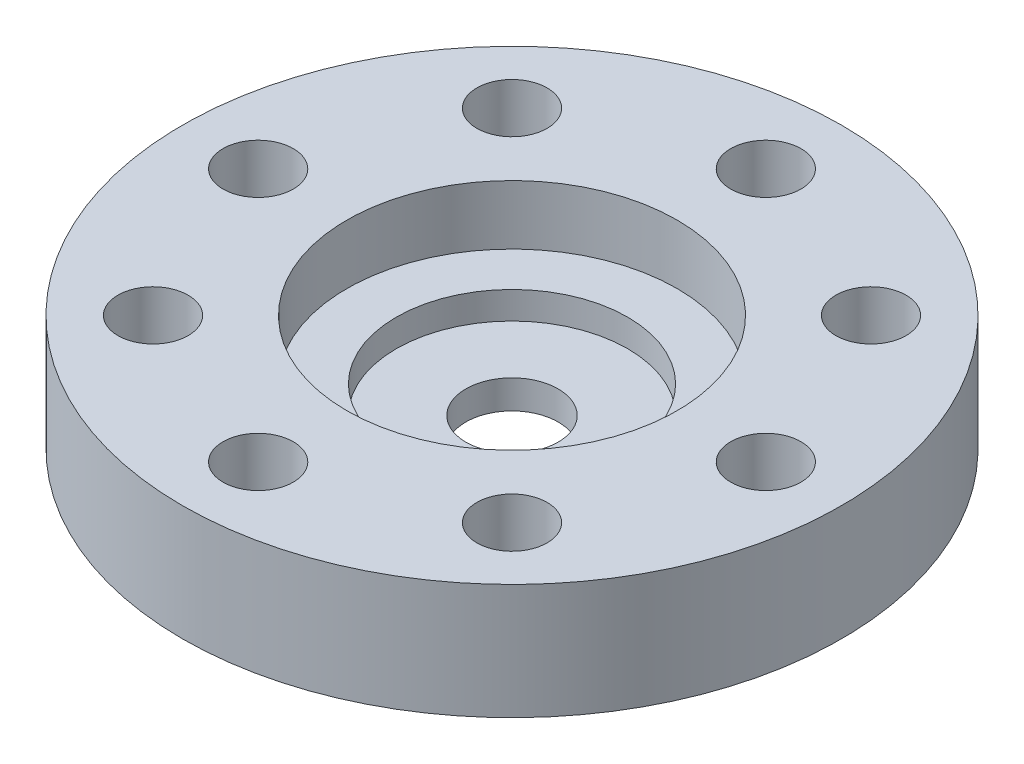
ISO-10303-21;
HEADER;
FILE_DESCRIPTION(('STEP AP214'),'2;1');
FILE_NAME('part.step','',(''),(''),'','','');
FILE_SCHEMA(('AUTOMOTIVE_DESIGN { 1 0 10303 214 1 1 1 1 }'));
ENDSEC;
DATA;
#1=APPLICATION_CONTEXT('core data for automotive mechanical design processes');
#2=APPLICATION_PROTOCOL_DEFINITION('international standard','automotive_design',2000,#1);
#3=PRODUCT_CONTEXT('',#1,'mechanical');
#4=PRODUCT('Part','Part','',(#3));
#5=PRODUCT_RELATED_PRODUCT_CATEGORY('part','',(#4));
#6=PRODUCT_DEFINITION_FORMATION('','',#4);
#7=PRODUCT_DEFINITION_CONTEXT('part definition',#1,'design');
#8=PRODUCT_DEFINITION('design','',#6,#7);
#9=PRODUCT_DEFINITION_SHAPE('','',#8);
#10=(LENGTH_UNIT() NAMED_UNIT(*) SI_UNIT(.MILLI.,.METRE.));
#11=(NAMED_UNIT(*) PLANE_ANGLE_UNIT() SI_UNIT($,.RADIAN.));
#12=(NAMED_UNIT(*) SI_UNIT($,.STERADIAN.) SOLID_ANGLE_UNIT());
#13=UNCERTAINTY_MEASURE_WITH_UNIT(LENGTH_MEASURE(1.E-05),#10,'distance_accuracy_value','');
#14=(GEOMETRIC_REPRESENTATION_CONTEXT(3) GLOBAL_UNCERTAINTY_ASSIGNED_CONTEXT((#13)) GLOBAL_UNIT_ASSIGNED_CONTEXT((#10,
#11,#12)) REPRESENTATION_CONTEXT('',''));
#15=CARTESIAN_POINT('',(0.,0.,0.));
#16=DIRECTION('',(0.,0.,1.));
#17=DIRECTION('',(1.,0.,0.));
#18=AXIS2_PLACEMENT_3D('',#15,#16,#17);
#19=CARTESIAN_POINT('',(0.,0.,0.));
#20=DIRECTION('',(0.,1.,0.));
#21=DIRECTION('',(0.,0.,1.));
#22=AXIS2_PLACEMENT_3D('',#19,#20,#21);
#23=PLANE('',#22);
#24=CARTESIAN_POINT('',(0.,5.21913241791072E-11,0.));
#25=DIRECTION('',(0.,1.,0.));
#26=DIRECTION('',(0.,0.,1.));
#27=AXIS2_PLACEMENT_3D('',#24,#25,#26);
#28=CIRCLE('',#27,4.12749999998141);
#29=CARTESIAN_POINT('',(0.,5.21913241791072E-11,4.12749999998141));
#30=VERTEX_POINT('',#29);
#31=EDGE_CURVE('E100',#30,#30,#28,.T.);
#32=ORIENTED_EDGE('',*,*,#31,.F.);
#33=EDGE_LOOP('',(#32));
#34=FACE_BOUND('',#33,.T.);
#35=CARTESIAN_POINT('',(0.,0.,0.));
#36=DIRECTION('',(0.,1.,0.));
#37=DIRECTION('',(0.,0.,1.));
#38=AXIS2_PLACEMENT_3D('',#35,#36,#37);
#39=CIRCLE('',#38,1.77799999999999);
#40=CARTESIAN_POINT('',(0.,0.,1.77799999999999));
#41=VERTEX_POINT('',#40);
#42=EDGE_CURVE('E18',#41,#41,#39,.T.);
#43=ORIENTED_EDGE('',*,*,#42,.T.);
#44=EDGE_LOOP('',(#43));
#45=FACE_BOUND('',#44,.T.);
#46=ADVANCED_FACE('F15',(#34,#45),#23,.F.);
#47=CARTESIAN_POINT('',(0.,2.159,0.));
#48=DIRECTION('',(0.,1.,0.));
#49=DIRECTION('',(0.,0.,1.));
#50=AXIS2_PLACEMENT_3D('',#47,#48,#49);
#51=CYLINDRICAL_SURFACE('',#50,1.77799999999999);
#52=ORIENTED_EDGE('',*,*,#42,.F.);
#53=EDGE_LOOP('',(#52));
#54=FACE_BOUND('',#53,.T.);
#55=CARTESIAN_POINT('',(0.,1.1049,0.));
#56=DIRECTION('',(0.,1.,0.));
#57=DIRECTION('',(0.,0.,1.));
#58=AXIS2_PLACEMENT_3D('',#55,#56,#57);
#59=CIRCLE('',#58,1.77799999999999);
#60=CARTESIAN_POINT('',(0.,1.1049,1.77799999999999));
#61=VERTEX_POINT('',#60);
#62=EDGE_CURVE('E98',#61,#61,#59,.F.);
#63=ORIENTED_EDGE('',*,*,#62,.F.);
#64=EDGE_LOOP('',(#63));
#65=FACE_BOUND('',#64,.T.);
#66=ADVANCED_FACE('F108',(#54,#65),#51,.F.);
#67=CARTESIAN_POINT('',(0.,1.21919999997999,0.));
#68=DIRECTION('',(0.,1.,0.));
#69=DIRECTION('',(0.,0.,1.));
#70=AXIS2_PLACEMENT_3D('',#67,#68,#69);
#71=CONICAL_SURFACE('',#70,5.39871959597349,0.806283010546046);
#72=ORIENTED_EDGE('',*,*,#31,.T.);
#73=EDGE_LOOP('',(#72));
#74=FACE_BOUND('',#73,.T.);
#75=CARTESIAN_POINT('',(0.,1.21920000008903,0.));
#76=DIRECTION('',(0.,1.,0.));
#77=DIRECTION('',(0.,0.,1.));
#78=AXIS2_PLACEMENT_3D('',#75,#76,#77);
#79=CIRCLE('',#78,5.39871959608718);
#80=CARTESIAN_POINT('',(0.,1.21920000008903,5.39871959608718));
#81=VERTEX_POINT('',#80);
#82=EDGE_CURVE('E95',#81,#81,#79,.T.);
#83=ORIENTED_EDGE('',*,*,#82,.F.);
#84=EDGE_LOOP('',(#83));
#85=FACE_BOUND('',#84,.T.);
#86=ADVANCED_FACE('F111',(#74,#85),#71,.T.);
#87=CARTESIAN_POINT('',(0.,1.1049,0.));
#88=DIRECTION('',(0.,1.,0.));
#89=DIRECTION('',(0.,0.,1.));
#90=AXIS2_PLACEMENT_3D('',#87,#88,#89);
#91=PLANE('',#90);
#92=ORIENTED_EDGE('',*,*,#62,.T.);
#93=EDGE_LOOP('',(#92));
#94=FACE_BOUND('',#93,.T.);
#95=CARTESIAN_POINT('',(0.,1.1049,0.));
#96=DIRECTION('',(0.,1.,0.));
#97=DIRECTION('',(0.,0.,1.));
#98=AXIS2_PLACEMENT_3D('',#95,#96,#97);
#99=CIRCLE('',#98,4.4577);
#100=CARTESIAN_POINT('',(0.,1.1049,4.4577));
#101=VERTEX_POINT('',#100);
#102=EDGE_CURVE('E92',#101,#101,#99,.T.);
#103=ORIENTED_EDGE('',*,*,#102,.T.);
#104=EDGE_LOOP('',(#103));
#105=FACE_BOUND('',#104,.T.);
#106=ADVANCED_FACE('F114',(#94,#105),#91,.T.);
#107=CARTESIAN_POINT('',(0.,1.2192,0.));
#108=DIRECTION('',(0.,-1.,0.));
#109=DIRECTION('',(0.,0.,-1.));
#110=AXIS2_PLACEMENT_3D('',#107,#108,#109);
#111=PLANE('',#110);
#112=CARTESIAN_POINT('',(0.,1.2192,0.));
#113=DIRECTION('',(0.,-1.,0.));
#114=DIRECTION('',(0.,0.,-1.));
#115=AXIS2_PLACEMENT_3D('',#112,#113,#114);
#116=CIRCLE('',#115,6.67517040391699);
#117=CARTESIAN_POINT('',(0.,1.2192,-6.67517040391699));
#118=VERTEX_POINT('',#117);
#119=EDGE_CURVE('E89',#118,#118,#116,.T.);
#120=ORIENTED_EDGE('',*,*,#119,.T.);
#121=EDGE_LOOP('',(#120));
#122=FACE_BOUND('',#121,.T.);
#123=ORIENTED_EDGE('',*,*,#82,.T.);
#124=EDGE_LOOP('',(#123));
#125=FACE_BOUND('',#124,.T.);
#126=ADVANCED_FACE('F117',(#122,#125),#111,.T.);
#127=CARTESIAN_POINT('',(0.,1.1049,0.));
#128=DIRECTION('',(0.,1.,0.));
#129=DIRECTION('',(0.,0.,1.));
#130=AXIS2_PLACEMENT_3D('',#127,#128,#129);
#131=CYLINDRICAL_SURFACE('',#130,4.4577);
#132=CARTESIAN_POINT('',(0.,2.159,0.));
#133=DIRECTION('',(0.,1.,0.));
#134=DIRECTION('',(0.,0.,1.));
#135=AXIS2_PLACEMENT_3D('',#132,#133,#134);
#136=CIRCLE('',#135,4.4577);
#137=CARTESIAN_POINT('',(0.,2.159,4.4577));
#138=VERTEX_POINT('',#137);
#139=EDGE_CURVE('E86',#138,#138,#136,.F.);
#140=ORIENTED_EDGE('',*,*,#139,.F.);
#141=EDGE_LOOP('',(#140));
#142=FACE_BOUND('',#141,.T.);
#143=ORIENTED_EDGE('',*,*,#102,.F.);
#144=EDGE_LOOP('',(#143));
#145=FACE_BOUND('',#144,.T.);
#146=ADVANCED_FACE('F121',(#142,#145),#131,.F.);
#147=CARTESIAN_POINT('',(0.,0.,0.));
#148=DIRECTION('',(0.,-1.,0.));
#149=DIRECTION('',(0.,0.,-1.));
#150=AXIS2_PLACEMENT_3D('',#147,#148,#149);
#151=CONICAL_SURFACE('',#150,7.94639,0.806283010552195);
#152=CARTESIAN_POINT('',(0.,0.,0.));
#153=DIRECTION('',(0.,-1.,0.));
#154=DIRECTION('',(0.,0.,-1.));
#155=AXIS2_PLACEMENT_3D('',#152,#153,#154);
#156=CIRCLE('',#155,7.94639);
#157=CARTESIAN_POINT('',(0.,0.,-7.94639));
#158=VERTEX_POINT('',#157);
#159=EDGE_CURVE('E83',#158,#158,#156,.T.);
#160=ORIENTED_EDGE('',*,*,#159,.T.);
#161=EDGE_LOOP('',(#160));
#162=FACE_BOUND('',#161,.T.);
#163=ORIENTED_EDGE('',*,*,#119,.F.);
#164=EDGE_LOOP('',(#163));
#165=FACE_BOUND('',#164,.T.);
#166=ADVANCED_FACE('F123',(#162,#165),#151,.F.);
#167=CARTESIAN_POINT('',(0.,2.159,0.));
#168=DIRECTION('',(0.,1.,0.));
#169=DIRECTION('',(0.,0.,1.));
#170=AXIS2_PLACEMENT_3D('',#167,#168,#169);
#171=PLANE('',#170);
#172=CARTESIAN_POINT('',(0.,2.159,0.));
#173=DIRECTION('',(0.,1.,0.));
#174=DIRECTION('',(0.,0.,1.));
#175=AXIS2_PLACEMENT_3D('',#172,#173,#174);
#176=CIRCLE('',#175,6.3627);
#177=CARTESIAN_POINT('',(0.,2.159,6.3627));
#178=VERTEX_POINT('',#177);
#179=EDGE_CURVE('E56',#178,#178,#176,.T.);
#180=ORIENTED_EDGE('',*,*,#179,.T.);
#181=EDGE_LOOP('',(#180));
#182=FACE_BOUND('',#181,.T.);
#183=ORIENTED_EDGE('',*,*,#139,.T.);
#184=EDGE_LOOP('',(#183));
#185=FACE_BOUND('',#184,.T.);
#186=ADVANCED_FACE('F131',(#182,#185),#171,.T.);
#187=CARTESIAN_POINT('',(0.,0.,0.));
#188=DIRECTION('',(0.,1.,0.));
#189=DIRECTION('',(0.,0.,1.));
#190=AXIS2_PLACEMENT_3D('',#187,#188,#189);
#191=PLANE('',#190);
#192=ORIENTED_EDGE('',*,*,#159,.F.);
#193=EDGE_LOOP('',(#192));
#194=FACE_BOUND('',#193,.T.);
#195=CARTESIAN_POINT('',(6.91479721322333,0.,6.91479721322316));
#196=DIRECTION('',(0.,1.,0.));
#197=DIRECTION('',(0.,0.,1.));
#198=AXIS2_PLACEMENT_3D('',#195,#196,#197);
#199=CIRCLE('',#198,1.35255);
#200=CARTESIAN_POINT('',(6.91479721322333,0.,8.26734721322316));
#201=VERTEX_POINT('',#200);
#202=EDGE_CURVE('E80',#201,#201,#199,.T.);
#203=ORIENTED_EDGE('',*,*,#202,.T.);
#204=EDGE_LOOP('',(#203));
#205=FACE_BOUND('',#204,.T.);
#206=CARTESIAN_POINT('',(1.02429588037641E-13,0.,9.779));
#207=DIRECTION('',(0.,1.,0.));
#208=DIRECTION('',(0.,0.,1.));
#209=AXIS2_PLACEMENT_3D('',#206,#207,#208);
#210=CIRCLE('',#209,1.35255);
#211=CARTESIAN_POINT('',(1.02429588037641E-13,0.,11.13155));
#212=VERTEX_POINT('',#211);
#213=EDGE_CURVE('E77',#212,#212,#210,.T.);
#214=ORIENTED_EDGE('',*,*,#213,.T.);
#215=EDGE_LOOP('',(#214));
#216=FACE_BOUND('',#215,.T.);
#217=CARTESIAN_POINT('',(-6.91479721322319,0.,6.91479721322331));
#218=DIRECTION('',(0.,1.,0.));
#219=DIRECTION('',(0.,0.,1.));
#220=AXIS2_PLACEMENT_3D('',#217,#218,#219);
#221=CIRCLE('',#220,1.35255);
#222=CARTESIAN_POINT('',(-6.91479721322319,0.,8.26734721322331));
#223=VERTEX_POINT('',#222);
#224=EDGE_CURVE('E74',#223,#223,#221,.T.);
#225=ORIENTED_EDGE('',*,*,#224,.T.);
#226=EDGE_LOOP('',(#225));
#227=FACE_BOUND('',#226,.T.);
#228=CARTESIAN_POINT('',(-9.779,0.,0.));
#229=DIRECTION('',(0.,1.,0.));
#230=DIRECTION('',(0.,0.,1.));
#231=AXIS2_PLACEMENT_3D('',#228,#229,#230);
#232=CIRCLE('',#231,1.35255);
#233=CARTESIAN_POINT('',(-9.779,0.,1.35255));
#234=VERTEX_POINT('',#233);
#235=EDGE_CURVE('E71',#234,#234,#232,.T.);
#236=ORIENTED_EDGE('',*,*,#235,.T.);
#237=EDGE_LOOP('',(#236));
#238=FACE_BOUND('',#237,.T.);
#239=CARTESIAN_POINT('',(-6.91479721322328,0.,-6.91479721322321));
#240=DIRECTION('',(0.,1.,0.));
#241=DIRECTION('',(0.,0.,1.));
#242=AXIS2_PLACEMENT_3D('',#239,#240,#241);
#243=CIRCLE('',#242,1.35255);
#244=CARTESIAN_POINT('',(-6.91479721322328,0.,-5.56224721322321));
#245=VERTEX_POINT('',#244);
#246=EDGE_CURVE('E68',#245,#245,#243,.T.);
#247=ORIENTED_EDGE('',*,*,#246,.T.);
#248=EDGE_LOOP('',(#247));
#249=FACE_BOUND('',#248,.T.);
#250=CARTESIAN_POINT('',(0.,0.,-9.779));
#251=DIRECTION('',(0.,1.,0.));
#252=DIRECTION('',(0.,0.,1.));
#253=AXIS2_PLACEMENT_3D('',#250,#251,#252);
#254=CIRCLE('',#253,1.35255);
#255=CARTESIAN_POINT('',(0.,0.,-8.42645));
#256=VERTEX_POINT('',#255);
#257=EDGE_CURVE('E65',#256,#256,#254,.T.);
#258=ORIENTED_EDGE('',*,*,#257,.T.);
#259=EDGE_LOOP('',(#258));
#260=FACE_BOUND('',#259,.T.);
#261=CARTESIAN_POINT('',(6.91479721322324,0.,-6.91479721322326));
#262=DIRECTION('',(0.,1.,0.));
#263=DIRECTION('',(0.,0.,1.));
#264=AXIS2_PLACEMENT_3D('',#261,#262,#263);
#265=CIRCLE('',#264,1.35255);
#266=CARTESIAN_POINT('',(6.91479721322324,0.,-5.56224721322326));
#267=VERTEX_POINT('',#266);
#268=EDGE_CURVE('E62',#267,#267,#265,.T.);
#269=ORIENTED_EDGE('',*,*,#268,.T.);
#270=EDGE_LOOP('',(#269));
#271=FACE_BOUND('',#270,.T.);
#272=CARTESIAN_POINT('',(9.779,0.,0.));
#273=DIRECTION('',(0.,1.,0.));
#274=DIRECTION('',(0.,0.,1.));
#275=AXIS2_PLACEMENT_3D('',#272,#273,#274);
#276=CIRCLE('',#275,1.35255);
#277=CARTESIAN_POINT('',(9.779,0.,1.35255));
#278=VERTEX_POINT('',#277);
#279=EDGE_CURVE('E59',#278,#278,#276,.T.);
#280=ORIENTED_EDGE('',*,*,#279,.T.);
#281=EDGE_LOOP('',(#280));
#282=FACE_BOUND('',#281,.T.);
#283=CARTESIAN_POINT('',(0.,0.,0.));
#284=DIRECTION('',(0.,-1.,0.));
#285=DIRECTION('',(0.,0.,-1.));
#286=AXIS2_PLACEMENT_3D('',#283,#284,#285);
#287=CIRCLE('',#286,12.69619);
#288=CARTESIAN_POINT('',(0.,0.,-12.69619));
#289=VERTEX_POINT('',#288);
#290=EDGE_CURVE('E53',#289,#289,#287,.F.);
#291=ORIENTED_EDGE('',*,*,#290,.F.);
#292=EDGE_LOOP('',(#291));
#293=FACE_BOUND('',#292,.T.);
#294=ADVANCED_FACE('F183',(#194,#205,#216,#227,#238,#249,#260,#271,#282,#293),#191,.F.);
#295=CARTESIAN_POINT('',(6.91479721322333,4.445,6.91479721322316));
#296=DIRECTION('',(0.,1.,0.));
#297=DIRECTION('',(0.,0.,1.));
#298=AXIS2_PLACEMENT_3D('',#295,#296,#297);
#299=CYLINDRICAL_SURFACE('',#298,1.35255);
#300=CARTESIAN_POINT('',(6.91479721322333,4.445,6.91479721322316));
#301=DIRECTION('',(0.,1.,0.));
#302=DIRECTION('',(0.,0.,1.));
#303=AXIS2_PLACEMENT_3D('',#300,#301,#302);
#304=CIRCLE('',#303,1.35255);
#305=CARTESIAN_POINT('',(6.91479721322333,4.445,8.26734721322316));
#306=VERTEX_POINT('',#305);
#307=EDGE_CURVE('E50',#306,#306,#304,.F.);
#308=ORIENTED_EDGE('',*,*,#307,.F.);
#309=EDGE_LOOP('',(#308));
#310=FACE_BOUND('',#309,.T.);
#311=ORIENTED_EDGE('',*,*,#202,.F.);
#312=EDGE_LOOP('',(#311));
#313=FACE_BOUND('',#312,.T.);
#314=ADVANCED_FACE('F179',(#310,#313),#299,.F.);
#315=CARTESIAN_POINT('',(1.02429588037641E-13,4.445,9.779));
#316=DIRECTION('',(0.,1.,0.));
#317=DIRECTION('',(0.,0.,1.));
#318=AXIS2_PLACEMENT_3D('',#315,#316,#317);
#319=CYLINDRICAL_SURFACE('',#318,1.35255);
#320=CARTESIAN_POINT('',(1.02429588037641E-13,4.445,9.779));
#321=DIRECTION('',(0.,1.,0.));
#322=DIRECTION('',(0.,0.,1.));
#323=AXIS2_PLACEMENT_3D('',#320,#321,#322);
#324=CIRCLE('',#323,1.35255);
#325=CARTESIAN_POINT('',(1.02429588037641E-13,4.445,11.13155));
#326=VERTEX_POINT('',#325);
#327=EDGE_CURVE('E47',#326,#326,#324,.F.);
#328=ORIENTED_EDGE('',*,*,#327,.F.);
#329=EDGE_LOOP('',(#328));
#330=FACE_BOUND('',#329,.T.);
#331=ORIENTED_EDGE('',*,*,#213,.F.);
#332=EDGE_LOOP('',(#331));
#333=FACE_BOUND('',#332,.T.);
#334=ADVANCED_FACE('F175',(#330,#333),#319,.F.);
#335=CARTESIAN_POINT('',(-6.91479721322319,4.445,6.91479721322331));
#336=DIRECTION('',(0.,1.,0.));
#337=DIRECTION('',(0.,0.,1.));
#338=AXIS2_PLACEMENT_3D('',#335,#336,#337);
#339=CYLINDRICAL_SURFACE('',#338,1.35255);
#340=CARTESIAN_POINT('',(-6.91479721322319,4.445,6.91479721322331));
#341=DIRECTION('',(0.,1.,0.));
#342=DIRECTION('',(0.,0.,1.));
#343=AXIS2_PLACEMENT_3D('',#340,#341,#342);
#344=CIRCLE('',#343,1.35255);
#345=CARTESIAN_POINT('',(-6.91479721322319,4.445,8.26734721322331));
#346=VERTEX_POINT('',#345);
#347=EDGE_CURVE('E44',#346,#346,#344,.F.);
#348=ORIENTED_EDGE('',*,*,#347,.F.);
#349=EDGE_LOOP('',(#348));
#350=FACE_BOUND('',#349,.T.);
#351=ORIENTED_EDGE('',*,*,#224,.F.);
#352=EDGE_LOOP('',(#351));
#353=FACE_BOUND('',#352,.T.);
#354=ADVANCED_FACE('F171',(#350,#353),#339,.F.);
#355=CARTESIAN_POINT('',(-9.779,4.445,0.));
#356=DIRECTION('',(0.,1.,0.));
#357=DIRECTION('',(0.,0.,1.));
#358=AXIS2_PLACEMENT_3D('',#355,#356,#357);
#359=CYLINDRICAL_SURFACE('',#358,1.35255);
#360=CARTESIAN_POINT('',(-9.779,4.445,0.));
#361=DIRECTION('',(0.,1.,0.));
#362=DIRECTION('',(0.,0.,1.));
#363=AXIS2_PLACEMENT_3D('',#360,#361,#362);
#364=CIRCLE('',#363,1.35255);
#365=CARTESIAN_POINT('',(-9.779,4.445,1.35255));
#366=VERTEX_POINT('',#365);
#367=EDGE_CURVE('E41',#366,#366,#364,.F.);
#368=ORIENTED_EDGE('',*,*,#367,.F.);
#369=EDGE_LOOP('',(#368));
#370=FACE_BOUND('',#369,.T.);
#371=ORIENTED_EDGE('',*,*,#235,.F.);
#372=EDGE_LOOP('',(#371));
#373=FACE_BOUND('',#372,.T.);
#374=ADVANCED_FACE('F167',(#370,#373),#359,.F.);
#375=CARTESIAN_POINT('',(-6.91479721322328,4.445,-6.91479721322321));
#376=DIRECTION('',(0.,1.,0.));
#377=DIRECTION('',(0.,0.,1.));
#378=AXIS2_PLACEMENT_3D('',#375,#376,#377);
#379=CYLINDRICAL_SURFACE('',#378,1.35255);
#380=CARTESIAN_POINT('',(-6.91479721322328,4.445,-6.91479721322321));
#381=DIRECTION('',(0.,1.,0.));
#382=DIRECTION('',(0.,0.,1.));
#383=AXIS2_PLACEMENT_3D('',#380,#381,#382);
#384=CIRCLE('',#383,1.35255);
#385=CARTESIAN_POINT('',(-6.91479721322328,4.445,-5.56224721322321));
#386=VERTEX_POINT('',#385);
#387=EDGE_CURVE('E38',#386,#386,#384,.F.);
#388=ORIENTED_EDGE('',*,*,#387,.F.);
#389=EDGE_LOOP('',(#388));
#390=FACE_BOUND('',#389,.T.);
#391=ORIENTED_EDGE('',*,*,#246,.F.);
#392=EDGE_LOOP('',(#391));
#393=FACE_BOUND('',#392,.T.);
#394=ADVANCED_FACE('F163',(#390,#393),#379,.F.);
#395=CARTESIAN_POINT('',(0.,4.445,-9.779));
#396=DIRECTION('',(0.,1.,0.));
#397=DIRECTION('',(0.,0.,1.));
#398=AXIS2_PLACEMENT_3D('',#395,#396,#397);
#399=CYLINDRICAL_SURFACE('',#398,1.35255);
#400=CARTESIAN_POINT('',(0.,4.445,-9.779));
#401=DIRECTION('',(0.,1.,0.));
#402=DIRECTION('',(0.,0.,1.));
#403=AXIS2_PLACEMENT_3D('',#400,#401,#402);
#404=CIRCLE('',#403,1.35255);
#405=CARTESIAN_POINT('',(0.,4.445,-8.42645));
#406=VERTEX_POINT('',#405);
#407=EDGE_CURVE('E35',#406,#406,#404,.F.);
#408=ORIENTED_EDGE('',*,*,#407,.F.);
#409=EDGE_LOOP('',(#408));
#410=FACE_BOUND('',#409,.T.);
#411=ORIENTED_EDGE('',*,*,#257,.F.);
#412=EDGE_LOOP('',(#411));
#413=FACE_BOUND('',#412,.T.);
#414=ADVANCED_FACE('F159',(#410,#413),#399,.F.);
#415=CARTESIAN_POINT('',(6.91479721322324,4.445,-6.91479721322326));
#416=DIRECTION('',(0.,1.,0.));
#417=DIRECTION('',(0.,0.,1.));
#418=AXIS2_PLACEMENT_3D('',#415,#416,#417);
#419=CYLINDRICAL_SURFACE('',#418,1.35255);
#420=CARTESIAN_POINT('',(6.91479721322324,4.445,-6.91479721322326));
#421=DIRECTION('',(0.,1.,0.));
#422=DIRECTION('',(0.,0.,1.));
#423=AXIS2_PLACEMENT_3D('',#420,#421,#422);
#424=CIRCLE('',#423,1.35255);
#425=CARTESIAN_POINT('',(6.91479721322324,4.445,-5.56224721322326));
#426=VERTEX_POINT('',#425);
#427=EDGE_CURVE('E32',#426,#426,#424,.F.);
#428=ORIENTED_EDGE('',*,*,#427,.F.);
#429=EDGE_LOOP('',(#428));
#430=FACE_BOUND('',#429,.T.);
#431=ORIENTED_EDGE('',*,*,#268,.F.);
#432=EDGE_LOOP('',(#431));
#433=FACE_BOUND('',#432,.T.);
#434=ADVANCED_FACE('F155',(#430,#433),#419,.F.);
#435=CARTESIAN_POINT('',(9.779,4.445,0.));
#436=DIRECTION('',(0.,1.,0.));
#437=DIRECTION('',(0.,0.,1.));
#438=AXIS2_PLACEMENT_3D('',#435,#436,#437);
#439=CYLINDRICAL_SURFACE('',#438,1.35255);
#440=CARTESIAN_POINT('',(9.779,4.445,0.));
#441=DIRECTION('',(0.,1.,0.));
#442=DIRECTION('',(0.,0.,1.));
#443=AXIS2_PLACEMENT_3D('',#440,#441,#442);
#444=CIRCLE('',#443,1.35255);
#445=CARTESIAN_POINT('',(9.779,4.445,1.35255));
#446=VERTEX_POINT('',#445);
#447=EDGE_CURVE('E27',#446,#446,#444,.F.);
#448=ORIENTED_EDGE('',*,*,#447,.F.);
#449=EDGE_LOOP('',(#448));
#450=FACE_BOUND('',#449,.T.);
#451=ORIENTED_EDGE('',*,*,#279,.F.);
#452=EDGE_LOOP('',(#451));
#453=FACE_BOUND('',#452,.T.);
#454=ADVANCED_FACE('F151',(#450,#453),#439,.F.);
#455=CARTESIAN_POINT('',(0.,2.159,0.));
#456=DIRECTION('',(0.,1.,0.));
#457=DIRECTION('',(0.,0.,1.));
#458=AXIS2_PLACEMENT_3D('',#455,#456,#457);
#459=CYLINDRICAL_SURFACE('',#458,6.3627);
#460=CARTESIAN_POINT('',(0.,4.445,0.));
#461=DIRECTION('',(0.,1.,0.));
#462=DIRECTION('',(0.,0.,1.));
#463=AXIS2_PLACEMENT_3D('',#460,#461,#462);
#464=CIRCLE('',#463,6.3627);
#465=CARTESIAN_POINT('',(0.,4.445,6.3627));
#466=VERTEX_POINT('',#465);
#467=EDGE_CURVE('E22',#466,#466,#464,.F.);
#468=ORIENTED_EDGE('',*,*,#467,.F.);
#469=EDGE_LOOP('',(#468));
#470=FACE_BOUND('',#469,.T.);
#471=ORIENTED_EDGE('',*,*,#179,.F.);
#472=EDGE_LOOP('',(#471));
#473=FACE_BOUND('',#472,.T.);
#474=ADVANCED_FACE('F144',(#470,#473),#459,.F.);
#475=CARTESIAN_POINT('',(0.,4.445,0.));
#476=DIRECTION('',(0.,-1.,0.));
#477=DIRECTION('',(0.,0.,-1.));
#478=AXIS2_PLACEMENT_3D('',#475,#476,#477);
#479=CYLINDRICAL_SURFACE('',#478,12.69619);
#480=ORIENTED_EDGE('',*,*,#290,.T.);
#481=EDGE_LOOP('',(#480));
#482=FACE_BOUND('',#481,.T.);
#483=CARTESIAN_POINT('',(0.,4.445,0.));
#484=DIRECTION('',(0.,-1.,0.));
#485=DIRECTION('',(0.,0.,-1.));
#486=AXIS2_PLACEMENT_3D('',#483,#484,#485);
#487=CIRCLE('',#486,12.69619);
#488=CARTESIAN_POINT('',(0.,4.445,-12.69619));
#489=VERTEX_POINT('',#488);
#490=EDGE_CURVE('E10',#489,#489,#487,.F.);
#491=ORIENTED_EDGE('',*,*,#490,.F.);
#492=EDGE_LOOP('',(#491));
#493=FACE_BOUND('',#492,.T.);
#494=ADVANCED_FACE('F139',(#482,#493),#479,.T.);
#495=CARTESIAN_POINT('',(0.,4.445,0.));
#496=DIRECTION('',(0.,1.,0.));
#497=DIRECTION('',(0.,0.,1.));
#498=AXIS2_PLACEMENT_3D('',#495,#496,#497);
#499=PLANE('',#498);
#500=ORIENTED_EDGE('',*,*,#490,.T.);
#501=EDGE_LOOP('',(#500));
#502=FACE_BOUND('',#501,.T.);
#503=ORIENTED_EDGE('',*,*,#467,.T.);
#504=EDGE_LOOP('',(#503));
#505=FACE_BOUND('',#504,.T.);
#506=ORIENTED_EDGE('',*,*,#447,.T.);
#507=EDGE_LOOP('',(#506));
#508=FACE_BOUND('',#507,.T.);
#509=ORIENTED_EDGE('',*,*,#427,.T.);
#510=EDGE_LOOP('',(#509));
#511=FACE_BOUND('',#510,.T.);
#512=ORIENTED_EDGE('',*,*,#407,.T.);
#513=EDGE_LOOP('',(#512));
#514=FACE_BOUND('',#513,.T.);
#515=ORIENTED_EDGE('',*,*,#387,.T.);
#516=EDGE_LOOP('',(#515));
#517=FACE_BOUND('',#516,.T.);
#518=ORIENTED_EDGE('',*,*,#367,.T.);
#519=EDGE_LOOP('',(#518));
#520=FACE_BOUND('',#519,.T.);
#521=ORIENTED_EDGE('',*,*,#347,.T.);
#522=EDGE_LOOP('',(#521));
#523=FACE_BOUND('',#522,.T.);
#524=ORIENTED_EDGE('',*,*,#327,.T.);
#525=EDGE_LOOP('',(#524));
#526=FACE_BOUND('',#525,.T.);
#527=ORIENTED_EDGE('',*,*,#307,.T.);
#528=EDGE_LOOP('',(#527));
#529=FACE_BOUND('',#528,.T.);
#530=ADVANCED_FACE('F137',(#502,#505,#508,#511,#514,#517,#520,#523,#526,#529),#499,.T.);
#531=CLOSED_SHELL('',(#46,#66,#86,#106,#126,#146,#166,#186,#294,#314,#334,#354,#374,#394,#414,
#434,#454,#474,#494,#530));
#532=MANIFOLD_SOLID_BREP('B1',#531);
#533=ADVANCED_BREP_SHAPE_REPRESENTATION('',(#18,#532),#14);
#534=SHAPE_DEFINITION_REPRESENTATION(#9,#533);
ENDSEC;
END-ISO-10303-21;
